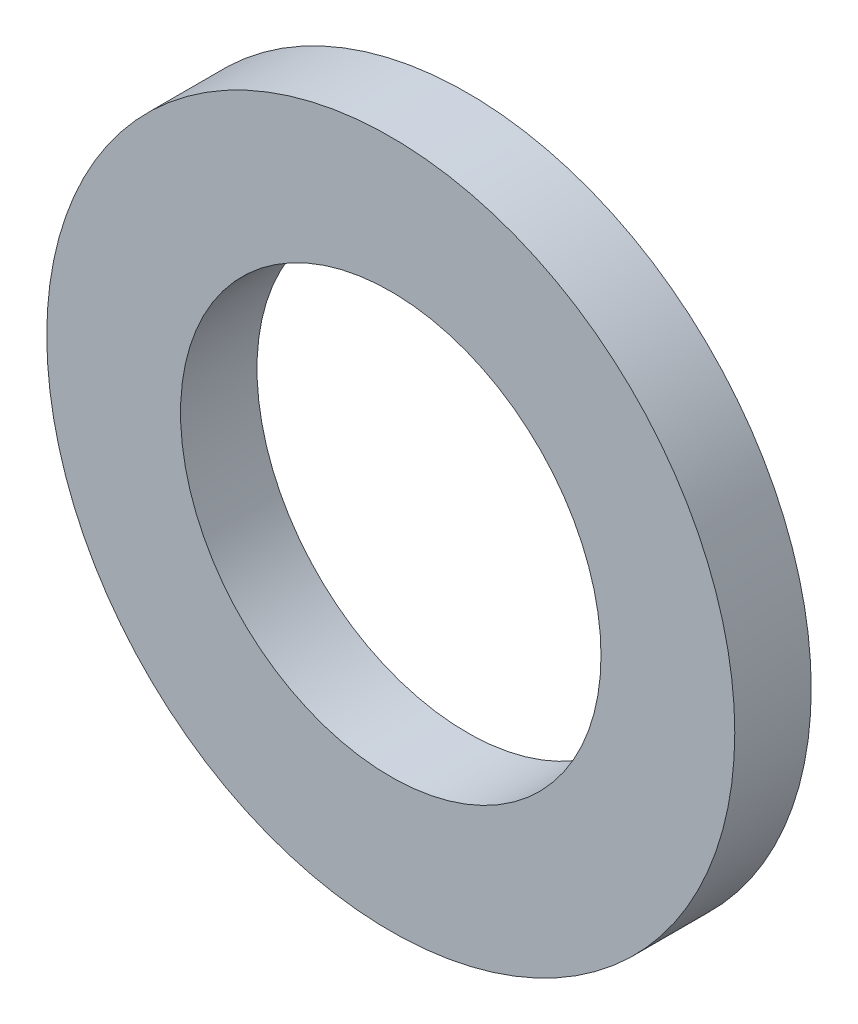
ISO-10303-21;
HEADER;
FILE_DESCRIPTION(('STEP AP214'),'2;1');
FILE_NAME('part.step','',(''),(''),'','','');
FILE_SCHEMA(('AUTOMOTIVE_DESIGN { 1 0 10303 214 1 1 1 1 }'));
ENDSEC;
DATA;
#1=APPLICATION_CONTEXT('core data for automotive mechanical design processes');
#2=APPLICATION_PROTOCOL_DEFINITION('international standard','automotive_design',2000,#1);
#3=PRODUCT_CONTEXT('',#1,'mechanical');
#4=PRODUCT('Part','Part','',(#3));
#5=PRODUCT_RELATED_PRODUCT_CATEGORY('part','',(#4));
#6=PRODUCT_DEFINITION_FORMATION('','',#4);
#7=PRODUCT_DEFINITION_CONTEXT('part definition',#1,'design');
#8=PRODUCT_DEFINITION('design','',#6,#7);
#9=PRODUCT_DEFINITION_SHAPE('','',#8);
#10=(LENGTH_UNIT() NAMED_UNIT(*) SI_UNIT(.MILLI.,.METRE.));
#11=(NAMED_UNIT(*) PLANE_ANGLE_UNIT() SI_UNIT($,.RADIAN.));
#12=(NAMED_UNIT(*) SI_UNIT($,.STERADIAN.) SOLID_ANGLE_UNIT());
#13=UNCERTAINTY_MEASURE_WITH_UNIT(LENGTH_MEASURE(1.E-05),#10,'distance_accuracy_value','');
#14=(GEOMETRIC_REPRESENTATION_CONTEXT(3) GLOBAL_UNCERTAINTY_ASSIGNED_CONTEXT((#13)) GLOBAL_UNIT_ASSIGNED_CONTEXT((#10,
#11,#12)) REPRESENTATION_CONTEXT('',''));
#15=CARTESIAN_POINT('',(0.,0.,0.));
#16=DIRECTION('',(0.,0.,1.));
#17=DIRECTION('',(1.,0.,0.));
#18=AXIS2_PLACEMENT_3D('',#15,#16,#17);
#19=CARTESIAN_POINT('',(0.,0.,-1.));
#20=DIRECTION('',(0.,0.,1.));
#21=DIRECTION('',(1.,0.,0.));
#22=AXIS2_PLACEMENT_3D('',#19,#20,#21);
#23=CYLINDRICAL_SURFACE('',#22,4.5);
#24=CARTESIAN_POINT('',(0.,0.,-1.));
#25=DIRECTION('',(0.,0.,1.));
#26=DIRECTION('',(1.,0.,0.));
#27=AXIS2_PLACEMENT_3D('',#24,#25,#26);
#28=CIRCLE('',#27,4.5);
#29=CARTESIAN_POINT('',(4.5,0.,-1.));
#30=VERTEX_POINT('',#29);
#31=EDGE_CURVE('E10',#30,#30,#28,.T.);
#32=ORIENTED_EDGE('',*,*,#31,.T.);
#33=EDGE_LOOP('',(#32));
#34=FACE_BOUND('',#33,.T.);
#35=CARTESIAN_POINT('',(0.,0.,0.));
#36=DIRECTION('',(0.,0.,1.));
#37=DIRECTION('',(1.,0.,0.));
#38=AXIS2_PLACEMENT_3D('',#35,#36,#37);
#39=CIRCLE('',#38,4.5);
#40=CARTESIAN_POINT('',(4.5,0.,0.));
#41=VERTEX_POINT('',#40);
#42=EDGE_CURVE('E33',#41,#41,#39,.T.);
#43=ORIENTED_EDGE('',*,*,#42,.F.);
#44=EDGE_LOOP('',(#43));
#45=FACE_BOUND('',#44,.T.);
#46=ADVANCED_FACE('F30',(#34,#45),#23,.T.);
#47=CARTESIAN_POINT('',(0.,0.,-1.));
#48=DIRECTION('',(0.,0.,1.));
#49=DIRECTION('',(1.,0.,0.));
#50=AXIS2_PLACEMENT_3D('',#47,#48,#49);
#51=PLANE('',#50);
#52=CARTESIAN_POINT('',(0.,0.,-1.));
#53=DIRECTION('',(0.,0.,1.));
#54=DIRECTION('',(1.,0.,0.));
#55=AXIS2_PLACEMENT_3D('',#52,#53,#54);
#56=CIRCLE('',#55,2.75);
#57=CARTESIAN_POINT('',(2.75,0.,-1.));
#58=VERTEX_POINT('',#57);
#59=EDGE_CURVE('E40',#58,#58,#56,.T.);
#60=ORIENTED_EDGE('',*,*,#59,.T.);
#61=EDGE_LOOP('',(#60));
#62=FACE_BOUND('',#61,.T.);
#63=ORIENTED_EDGE('',*,*,#31,.F.);
#64=EDGE_LOOP('',(#63));
#65=FACE_BOUND('',#64,.T.);
#66=ADVANCED_FACE('F48',(#62,#65),#51,.F.);
#67=CARTESIAN_POINT('',(0.,0.,0.));
#68=DIRECTION('',(0.,0.,1.));
#69=DIRECTION('',(1.,0.,0.));
#70=AXIS2_PLACEMENT_3D('',#67,#68,#69);
#71=PLANE('',#70);
#72=CARTESIAN_POINT('',(0.,0.,0.));
#73=DIRECTION('',(0.,0.,1.));
#74=DIRECTION('',(1.,0.,0.));
#75=AXIS2_PLACEMENT_3D('',#72,#73,#74);
#76=CIRCLE('',#75,2.75);
#77=CARTESIAN_POINT('',(2.75,0.,0.));
#78=VERTEX_POINT('',#77);
#79=EDGE_CURVE('E42',#78,#78,#76,.T.);
#80=ORIENTED_EDGE('',*,*,#79,.F.);
#81=EDGE_LOOP('',(#80));
#82=FACE_BOUND('',#81,.T.);
#83=ORIENTED_EDGE('',*,*,#42,.T.);
#84=EDGE_LOOP('',(#83));
#85=FACE_BOUND('',#84,.T.);
#86=ADVANCED_FACE('F54',(#82,#85),#71,.T.);
#87=CARTESIAN_POINT('',(0.,0.,-1.));
#88=DIRECTION('',(0.,0.,1.));
#89=DIRECTION('',(1.,0.,0.));
#90=AXIS2_PLACEMENT_3D('',#87,#88,#89);
#91=CYLINDRICAL_SURFACE('',#90,2.75);
#92=ORIENTED_EDGE('',*,*,#59,.F.);
#93=EDGE_LOOP('',(#92));
#94=FACE_BOUND('',#93,.T.);
#95=ORIENTED_EDGE('',*,*,#79,.T.);
#96=EDGE_LOOP('',(#95));
#97=FACE_BOUND('',#96,.T.);
#98=ADVANCED_FACE('F51',(#94,#97),#91,.F.);
#99=CLOSED_SHELL('',(#46,#66,#86,#98));
#100=MANIFOLD_SOLID_BREP('B2',#99);
#101=ADVANCED_BREP_SHAPE_REPRESENTATION('',(#18,#100),#14);
#102=SHAPE_DEFINITION_REPRESENTATION(#9,#101);
ENDSEC;
END-ISO-10303-21;
